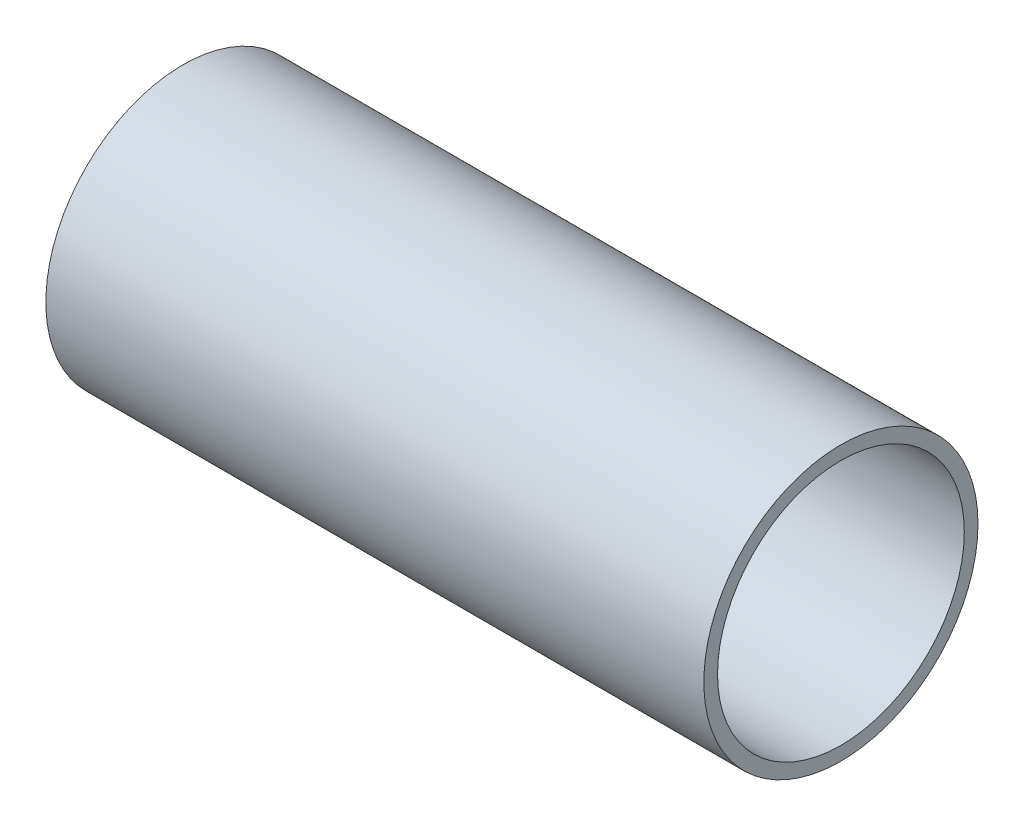
ISO-10303-21;
HEADER;
FILE_DESCRIPTION(('STEP AP214'),'2;1');
FILE_NAME('part.step','',(''),(''),'','','');
FILE_SCHEMA(('AUTOMOTIVE_DESIGN { 1 0 10303 214 1 1 1 1 }'));
ENDSEC;
DATA;
#1=APPLICATION_CONTEXT('core data for automotive mechanical design processes');
#2=APPLICATION_PROTOCOL_DEFINITION('international standard','automotive_design',2000,#1);
#3=PRODUCT_CONTEXT('',#1,'mechanical');
#4=PRODUCT('Part','Part','',(#3));
#5=PRODUCT_RELATED_PRODUCT_CATEGORY('part','',(#4));
#6=PRODUCT_DEFINITION_FORMATION('','',#4);
#7=PRODUCT_DEFINITION_CONTEXT('part definition',#1,'design');
#8=PRODUCT_DEFINITION('design','',#6,#7);
#9=PRODUCT_DEFINITION_SHAPE('','',#8);
#10=(LENGTH_UNIT() NAMED_UNIT(*) SI_UNIT(.MILLI.,.METRE.));
#11=(NAMED_UNIT(*) PLANE_ANGLE_UNIT() SI_UNIT($,.RADIAN.));
#12=(NAMED_UNIT(*) SI_UNIT($,.STERADIAN.) SOLID_ANGLE_UNIT());
#13=UNCERTAINTY_MEASURE_WITH_UNIT(LENGTH_MEASURE(1.E-05),#10,'distance_accuracy_value','');
#14=(GEOMETRIC_REPRESENTATION_CONTEXT(3) GLOBAL_UNCERTAINTY_ASSIGNED_CONTEXT((#13)) GLOBAL_UNIT_ASSIGNED_CONTEXT((#10,
#11,#12)) REPRESENTATION_CONTEXT('',''));
#15=CARTESIAN_POINT('',(0.,0.,0.));
#16=DIRECTION('',(0.,0.,1.));
#17=DIRECTION('',(1.,0.,0.));
#18=AXIS2_PLACEMENT_3D('',#15,#16,#17);
#19=CARTESIAN_POINT('',(-152.4,0.,0.));
#20=DIRECTION('',(1.,0.,0.));
#21=DIRECTION('',(0.,0.,-1.));
#22=AXIS2_PLACEMENT_3D('',#19,#20,#21);
#23=CYLINDRICAL_SURFACE('',#22,31.75);
#24=CARTESIAN_POINT('',(-152.4,0.,0.));
#25=DIRECTION('',(1.,0.,0.));
#26=DIRECTION('',(0.,0.,-1.));
#27=AXIS2_PLACEMENT_3D('',#24,#25,#26);
#28=CIRCLE('',#27,31.75);
#29=CARTESIAN_POINT('',(-152.4,0.,-31.75));
#30=VERTEX_POINT('',#29);
#31=EDGE_CURVE('E10',#30,#30,#28,.T.);
#32=CARTESIAN_POINT('',(0.,0.,0.));
#33=DIRECTION('',(1.,0.,0.));
#34=DIRECTION('',(0.,0.,-1.));
#35=AXIS2_PLACEMENT_3D('',#32,#33,#34);
#36=CIRCLE('',#35,31.75);
#37=CARTESIAN_POINT('',(0.,0.,-31.75));
#38=VERTEX_POINT('',#37);
#39=EDGE_CURVE('E36',#38,#38,#36,.T.);
#40=CARTESIAN_POINT('',(-152.4,0.,-31.75));
#41=CARTESIAN_POINT('',(-150.8125,0.,-31.75));
#42=CARTESIAN_POINT('',(-149.225,0.,-31.75));
#43=CARTESIAN_POINT('',(-146.05,0.,-31.75));
#44=CARTESIAN_POINT('',(-144.4625,0.,-31.75));
#45=CARTESIAN_POINT('',(-141.2875,0.,-31.75));
#46=CARTESIAN_POINT('',(-139.7,0.,-31.75));
#47=CARTESIAN_POINT('',(-136.525,0.,-31.75));
#48=CARTESIAN_POINT('',(-134.9375,0.,-31.75));
#49=CARTESIAN_POINT('',(-131.7625,0.,-31.75));
#50=CARTESIAN_POINT('',(-130.175,0.,-31.75));
#51=CARTESIAN_POINT('',(-127.,0.,-31.75));
#52=CARTESIAN_POINT('',(-125.4125,0.,-31.75));
#53=CARTESIAN_POINT('',(-122.2375,0.,-31.75));
#54=CARTESIAN_POINT('',(-120.65,0.,-31.75));
#55=CARTESIAN_POINT('',(-117.475,0.,-31.75));
#56=CARTESIAN_POINT('',(-115.8875,0.,-31.75));
#57=CARTESIAN_POINT('',(-112.7125,0.,-31.75));
#58=CARTESIAN_POINT('',(-111.125,0.,-31.75));
#59=CARTESIAN_POINT('',(-107.95,0.,-31.75));
#60=CARTESIAN_POINT('',(-106.3625,0.,-31.75));
#61=CARTESIAN_POINT('',(-103.1875,0.,-31.75));
#62=CARTESIAN_POINT('',(-101.6,0.,-31.75));
#63=CARTESIAN_POINT('',(-98.425,0.,-31.75));
#64=CARTESIAN_POINT('',(-96.8375,0.,-31.75));
#65=CARTESIAN_POINT('',(-93.6625,0.,-31.75));
#66=CARTESIAN_POINT('',(-92.075,0.,-31.75));
#67=CARTESIAN_POINT('',(-88.9,0.,-31.75));
#68=CARTESIAN_POINT('',(-87.3125,0.,-31.75));
#69=CARTESIAN_POINT('',(-84.1375,0.,-31.75));
#70=CARTESIAN_POINT('',(-82.55,0.,-31.75));
#71=CARTESIAN_POINT('',(-79.375,0.,-31.75));
#72=CARTESIAN_POINT('',(-77.7875,0.,-31.75));
#73=CARTESIAN_POINT('',(-74.6125,0.,-31.75));
#74=CARTESIAN_POINT('',(-73.025,0.,-31.75));
#75=CARTESIAN_POINT('',(-69.85,0.,-31.75));
#76=CARTESIAN_POINT('',(-68.2625,0.,-31.75));
#77=CARTESIAN_POINT('',(-65.0875,0.,-31.75));
#78=CARTESIAN_POINT('',(-63.5,0.,-31.75));
#79=CARTESIAN_POINT('',(-60.325,0.,-31.75));
#80=CARTESIAN_POINT('',(-58.7375,0.,-31.75));
#81=CARTESIAN_POINT('',(-55.5625,0.,-31.75));
#82=CARTESIAN_POINT('',(-53.975,0.,-31.75));
#83=CARTESIAN_POINT('',(-50.8,0.,-31.75));
#84=CARTESIAN_POINT('',(-49.2125,0.,-31.75));
#85=CARTESIAN_POINT('',(-46.0375,0.,-31.75));
#86=CARTESIAN_POINT('',(-44.45,0.,-31.75));
#87=CARTESIAN_POINT('',(-41.275,0.,-31.75));
#88=CARTESIAN_POINT('',(-39.6875,0.,-31.75));
#89=CARTESIAN_POINT('',(-36.5125,0.,-31.75));
#90=CARTESIAN_POINT('',(-34.925,0.,-31.75));
#91=CARTESIAN_POINT('',(-31.75,0.,-31.75));
#92=CARTESIAN_POINT('',(-30.1625,0.,-31.75));
#93=CARTESIAN_POINT('',(-26.9875,0.,-31.75));
#94=CARTESIAN_POINT('',(-25.4,0.,-31.75));
#95=CARTESIAN_POINT('',(-22.225,0.,-31.75));
#96=CARTESIAN_POINT('',(-20.6375,0.,-31.75));
#97=CARTESIAN_POINT('',(-17.4625,0.,-31.75));
#98=CARTESIAN_POINT('',(-15.875,0.,-31.75));
#99=CARTESIAN_POINT('',(-12.7,0.,-31.75));
#100=CARTESIAN_POINT('',(-11.1125,0.,-31.75));
#101=CARTESIAN_POINT('',(-7.93750000000001,0.,-31.75));
#102=CARTESIAN_POINT('',(-6.35,0.,-31.75));
#103=CARTESIAN_POINT('',(-3.175,0.,-31.75));
#104=CARTESIAN_POINT('',(-1.5875,0.,-31.75));
#105=CARTESIAN_POINT('',(0.,0.,-31.75));
#106=B_SPLINE_CURVE_WITH_KNOTS('',3,(#40,#41,#42,#43,#44,#45,#46,#47,#48,#49,#50,#51,#52,#53,
#54,#55,#56,#57,#58,#59,#60,#61,#62,#63,#64,#65,#66,#67,#68,#69,#70,#71,#72,#73,#74,#75,#76,#77,
#78,#79,#80,#81,#82,#83,#84,#85,#86,#87,#88,#89,#90,#91,#92,#93,#94,#95,#96,#97,#98,#99,#100,
#101,#102,#103,#104,#105),.UNSPECIFIED.,.F.,.F.,(4,2,2,2,2,2,2,2,2,2,2,2,2,2,2,2,2,2,2,2,2,2,2,
2,2,2,2,2,2,2,2,2,4),(0.,4.76249999999998,9.52499999999998,14.2875,19.05,23.8125,28.575,33.3375,
38.1,42.8625,47.625,52.3875,57.15,61.9125,66.675,71.4375,76.2,80.9625,85.725,90.4875,95.25,
100.0125,104.775,109.5375,114.3,119.0625,123.825,128.5875,133.35,138.1125,142.875,147.6375,
152.4),.UNSPECIFIED.);
#107=EDGE_CURVE('BSEAM30',#30,#38,#106,.T.);
#108=ORIENTED_EDGE('',*,*,#31,.T.);
#109=ORIENTED_EDGE('',*,*,#39,.F.);
#110=ORIENTED_EDGE('',*,*,#107,.T.);
#111=ORIENTED_EDGE('',*,*,#107,.F.);
#112=EDGE_LOOP('',(#108,#110,#109,#111));
#113=FACE_BOUND('',#112,.T.);
#114=ADVANCED_FACE('F30',(#113),#23,.T.);
#115=CARTESIAN_POINT('',(-152.4,0.,0.));
#116=DIRECTION('',(1.,0.,0.));
#117=DIRECTION('',(0.,0.,-1.));
#118=AXIS2_PLACEMENT_3D('',#115,#116,#117);
#119=PLANE('',#118);
#120=CARTESIAN_POINT('',(-152.4,0.,0.));
#121=DIRECTION('',(1.,0.,0.));
#122=DIRECTION('',(0.,0.,-1.));
#123=AXIS2_PLACEMENT_3D('',#120,#121,#122);
#124=CIRCLE('',#123,28.575);
#125=CARTESIAN_POINT('',(-152.4,0.,-28.575));
#126=VERTEX_POINT('',#125);
#127=EDGE_CURVE('E40',#126,#126,#124,.T.);
#128=ORIENTED_EDGE('',*,*,#127,.T.);
#129=EDGE_LOOP('',(#128));
#130=FACE_BOUND('',#129,.T.);
#131=ORIENTED_EDGE('',*,*,#31,.F.);
#132=EDGE_LOOP('',(#131));
#133=FACE_BOUND('',#132,.T.);
#134=ADVANCED_FACE('F54',(#130,#133),#119,.F.);
#135=CARTESIAN_POINT('',(0.,0.,0.));
#136=DIRECTION('',(1.,0.,0.));
#137=DIRECTION('',(0.,0.,-1.));
#138=AXIS2_PLACEMENT_3D('',#135,#136,#137);
#139=PLANE('',#138);
#140=CARTESIAN_POINT('',(0.,0.,0.));
#141=DIRECTION('',(1.,0.,0.));
#142=DIRECTION('',(0.,0.,-1.));
#143=AXIS2_PLACEMENT_3D('',#140,#141,#142);
#144=CIRCLE('',#143,28.575);
#145=CARTESIAN_POINT('',(0.,0.,-28.575));
#146=VERTEX_POINT('',#145);
#147=EDGE_CURVE('E44',#146,#146,#144,.T.);
#148=ORIENTED_EDGE('',*,*,#147,.F.);
#149=EDGE_LOOP('',(#148));
#150=FACE_BOUND('',#149,.T.);
#151=ORIENTED_EDGE('',*,*,#39,.T.);
#152=EDGE_LOOP('',(#151));
#153=FACE_BOUND('',#152,.T.);
#154=ADVANCED_FACE('F52',(#150,#153),#139,.T.);
#155=CARTESIAN_POINT('',(-152.4,0.,0.));
#156=DIRECTION('',(1.,0.,0.));
#157=DIRECTION('',(0.,0.,-1.));
#158=AXIS2_PLACEMENT_3D('',#155,#156,#157);
#159=CYLINDRICAL_SURFACE('',#158,28.575);
#160=CARTESIAN_POINT('',(-152.4,0.,-28.575));
#161=CARTESIAN_POINT('',(-150.8125,0.,-28.575));
#162=CARTESIAN_POINT('',(-149.225,0.,-28.575));
#163=CARTESIAN_POINT('',(-146.05,0.,-28.575));
#164=CARTESIAN_POINT('',(-144.4625,0.,-28.575));
#165=CARTESIAN_POINT('',(-141.2875,0.,-28.575));
#166=CARTESIAN_POINT('',(-139.7,0.,-28.575));
#167=CARTESIAN_POINT('',(-136.525,0.,-28.575));
#168=CARTESIAN_POINT('',(-134.9375,0.,-28.575));
#169=CARTESIAN_POINT('',(-131.7625,0.,-28.575));
#170=CARTESIAN_POINT('',(-130.175,0.,-28.575));
#171=CARTESIAN_POINT('',(-127.,0.,-28.575));
#172=CARTESIAN_POINT('',(-125.4125,0.,-28.575));
#173=CARTESIAN_POINT('',(-122.2375,0.,-28.575));
#174=CARTESIAN_POINT('',(-120.65,0.,-28.575));
#175=CARTESIAN_POINT('',(-117.475,0.,-28.575));
#176=CARTESIAN_POINT('',(-115.8875,0.,-28.575));
#177=CARTESIAN_POINT('',(-112.7125,0.,-28.575));
#178=CARTESIAN_POINT('',(-111.125,0.,-28.575));
#179=CARTESIAN_POINT('',(-107.95,0.,-28.575));
#180=CARTESIAN_POINT('',(-106.3625,0.,-28.575));
#181=CARTESIAN_POINT('',(-103.1875,0.,-28.575));
#182=CARTESIAN_POINT('',(-101.6,0.,-28.575));
#183=CARTESIAN_POINT('',(-98.425,0.,-28.575));
#184=CARTESIAN_POINT('',(-96.8375,0.,-28.575));
#185=CARTESIAN_POINT('',(-93.6625,0.,-28.575));
#186=CARTESIAN_POINT('',(-92.075,0.,-28.575));
#187=CARTESIAN_POINT('',(-88.9,0.,-28.575));
#188=CARTESIAN_POINT('',(-87.3125,0.,-28.575));
#189=CARTESIAN_POINT('',(-84.1375,0.,-28.575));
#190=CARTESIAN_POINT('',(-82.55,0.,-28.575));
#191=CARTESIAN_POINT('',(-79.375,0.,-28.575));
#192=CARTESIAN_POINT('',(-77.7875,0.,-28.575));
#193=CARTESIAN_POINT('',(-74.6125,0.,-28.575));
#194=CARTESIAN_POINT('',(-73.025,0.,-28.575));
#195=CARTESIAN_POINT('',(-69.85,0.,-28.575));
#196=CARTESIAN_POINT('',(-68.2625,0.,-28.575));
#197=CARTESIAN_POINT('',(-65.0875,0.,-28.575));
#198=CARTESIAN_POINT('',(-63.5,0.,-28.575));
#199=CARTESIAN_POINT('',(-60.325,0.,-28.575));
#200=CARTESIAN_POINT('',(-58.7375,0.,-28.575));
#201=CARTESIAN_POINT('',(-55.5625,0.,-28.575));
#202=CARTESIAN_POINT('',(-53.975,0.,-28.575));
#203=CARTESIAN_POINT('',(-50.8,0.,-28.575));
#204=CARTESIAN_POINT('',(-49.2125,0.,-28.575));
#205=CARTESIAN_POINT('',(-46.0375,0.,-28.575));
#206=CARTESIAN_POINT('',(-44.45,0.,-28.575));
#207=CARTESIAN_POINT('',(-41.275,0.,-28.575));
#208=CARTESIAN_POINT('',(-39.6875,0.,-28.575));
#209=CARTESIAN_POINT('',(-36.5125,0.,-28.575));
#210=CARTESIAN_POINT('',(-34.925,0.,-28.575));
#211=CARTESIAN_POINT('',(-31.75,0.,-28.575));
#212=CARTESIAN_POINT('',(-30.1625,0.,-28.575));
#213=CARTESIAN_POINT('',(-26.9875,0.,-28.575));
#214=CARTESIAN_POINT('',(-25.4,0.,-28.575));
#215=CARTESIAN_POINT('',(-22.225,0.,-28.575));
#216=CARTESIAN_POINT('',(-20.6375,0.,-28.575));
#217=CARTESIAN_POINT('',(-17.4625,0.,-28.575));
#218=CARTESIAN_POINT('',(-15.875,0.,-28.575));
#219=CARTESIAN_POINT('',(-12.7,0.,-28.575));
#220=CARTESIAN_POINT('',(-11.1125,0.,-28.575));
#221=CARTESIAN_POINT('',(-7.93750000000001,0.,-28.575));
#222=CARTESIAN_POINT('',(-6.35,0.,-28.575));
#223=CARTESIAN_POINT('',(-3.175,0.,-28.575));
#224=CARTESIAN_POINT('',(-1.5875,0.,-28.575));
#225=CARTESIAN_POINT('',(0.,0.,-28.575));
#226=B_SPLINE_CURVE_WITH_KNOTS('',3,(#160,#161,#162,#163,#164,#165,#166,#167,#168,#169,#170,
#171,#172,#173,#174,#175,#176,#177,#178,#179,#180,#181,#182,#183,#184,#185,#186,#187,#188,#189,
#190,#191,#192,#193,#194,#195,#196,#197,#198,#199,#200,#201,#202,#203,#204,#205,#206,#207,#208,
#209,#210,#211,#212,#213,#214,#215,#216,#217,#218,#219,#220,#221,#222,#223,#224,#225),
.UNSPECIFIED.,.F.,.F.,(4,2,2,2,2,2,2,2,2,2,2,2,2,2,2,2,2,2,2,2,2,2,2,2,2,2,2,2,2,2,2,2,4),(0.,
4.76249999999998,9.52499999999998,14.2875,19.05,23.8125,28.575,33.3375,38.1,42.8625,47.625,
52.3875,57.15,61.9125,66.675,71.4375,76.2,80.9625,85.725,90.4875,95.25,100.0125,104.775,
109.5375,114.3,119.0625,123.825,128.5875,133.35,138.1125,142.875,147.6375,152.4),.UNSPECIFIED.);
#227=EDGE_CURVE('BSEAM50',#126,#146,#226,.T.);
#228=ORIENTED_EDGE('',*,*,#127,.F.);
#229=ORIENTED_EDGE('',*,*,#147,.T.);
#230=ORIENTED_EDGE('',*,*,#227,.T.);
#231=ORIENTED_EDGE('',*,*,#227,.F.);
#232=EDGE_LOOP('',(#228,#230,#229,#231));
#233=FACE_BOUND('',#232,.T.);
#234=ADVANCED_FACE('F50',(#233),#159,.F.);
#235=CLOSED_SHELL('',(#114,#134,#154,#234));
#236=MANIFOLD_SOLID_BREP('B2',#235);
#237=ADVANCED_BREP_SHAPE_REPRESENTATION('',(#18,#236),#14);
#238=SHAPE_DEFINITION_REPRESENTATION(#9,#237);
ENDSEC;
END-ISO-10303-21;
